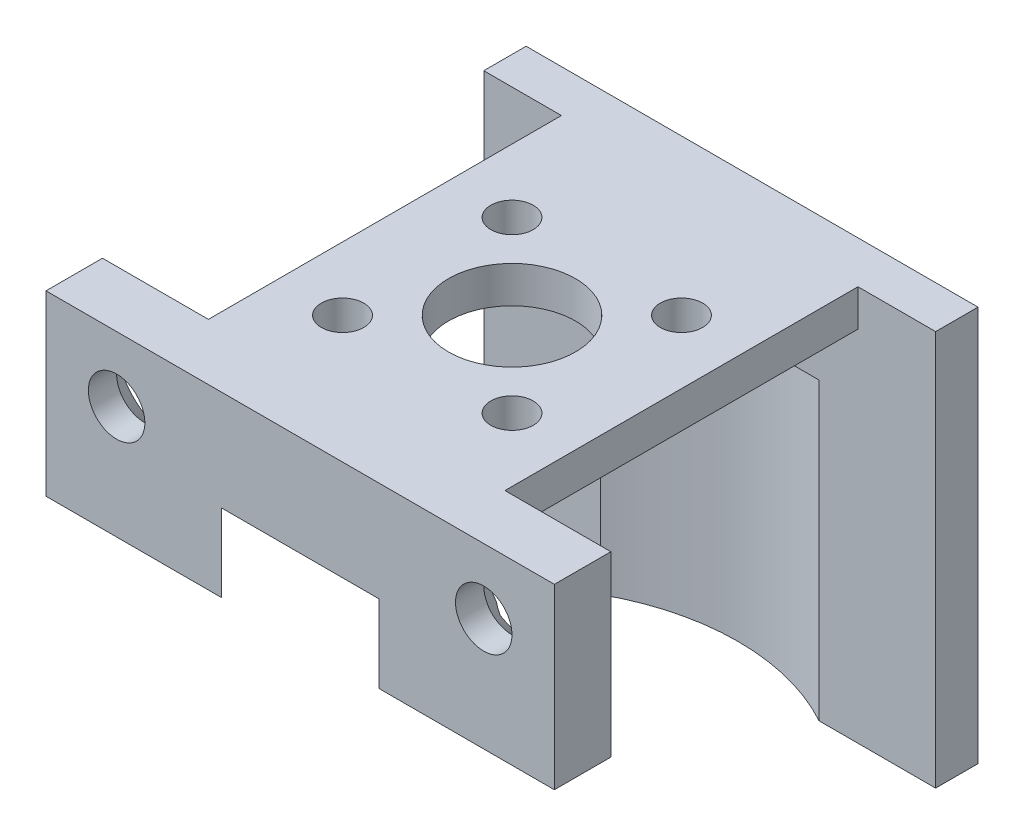
ISO-10303-21;
HEADER;
FILE_DESCRIPTION(('STEP AP214'),'2;1');
FILE_NAME('part.step','',(''),(''),'','','');
FILE_SCHEMA(('AUTOMOTIVE_DESIGN { 1 0 10303 214 1 1 1 1 }'));
ENDSEC;
DATA;
#1=APPLICATION_CONTEXT('core data for automotive mechanical design processes');
#2=APPLICATION_PROTOCOL_DEFINITION('international standard','automotive_design',2000,#1);
#3=PRODUCT_CONTEXT('',#1,'mechanical');
#4=PRODUCT('Part','Part','',(#3));
#5=PRODUCT_RELATED_PRODUCT_CATEGORY('part','',(#4));
#6=PRODUCT_DEFINITION_FORMATION('','',#4);
#7=PRODUCT_DEFINITION_CONTEXT('part definition',#1,'design');
#8=PRODUCT_DEFINITION('design','',#6,#7);
#9=PRODUCT_DEFINITION_SHAPE('','',#8);
#10=(LENGTH_UNIT() NAMED_UNIT(*) SI_UNIT(.MILLI.,.METRE.));
#11=(NAMED_UNIT(*) PLANE_ANGLE_UNIT() SI_UNIT($,.RADIAN.));
#12=(NAMED_UNIT(*) SI_UNIT($,.STERADIAN.) SOLID_ANGLE_UNIT());
#13=UNCERTAINTY_MEASURE_WITH_UNIT(LENGTH_MEASURE(1.E-05),#10,'distance_accuracy_value','');
#14=(GEOMETRIC_REPRESENTATION_CONTEXT(3) GLOBAL_UNCERTAINTY_ASSIGNED_CONTEXT((#13)) GLOBAL_UNIT_ASSIGNED_CONTEXT((#10,
#11,#12)) REPRESENTATION_CONTEXT('',''));
#15=CARTESIAN_POINT('',(0.,0.,0.));
#16=DIRECTION('',(0.,0.,1.));
#17=DIRECTION('',(1.,0.,0.));
#18=AXIS2_PLACEMENT_3D('',#15,#16,#17);
#19=CARTESIAN_POINT('',(-9.,1.3,5.5));
#20=DIRECTION('',(0.,0.,1.));
#21=DIRECTION('',(1.,0.,0.));
#22=AXIS2_PLACEMENT_3D('',#19,#20,#21);
#23=PLANE('',#22);
#24=DIRECTION('',(-1.,0.,0.));
#25=VECTOR('',#24,1.);
#26=CARTESIAN_POINT('',(-9.,0.,5.5));
#27=LINE('',#26,#25);
#28=CARTESIAN_POINT('',(4.76794919243112,0.,5.5));
#29=VERTEX_POINT('',#28);
#30=CARTESIAN_POINT('',(-4.76794919243112,0.,5.5));
#31=VERTEX_POINT('',#30);
#32=EDGE_CURVE('E294',#29,#31,#27,.T.);
#33=ORIENTED_EDGE('',*,*,#32,.F.);
#34=CARTESIAN_POINT('',(6.5,-1.,5.5));
#35=DIRECTION('',(0.,0.,1.));
#36=DIRECTION('',(1.,0.,0.));
#37=AXIS2_PLACEMENT_3D('',#34,#35,#36);
#38=CIRCLE('',#37,2.);
#39=CARTESIAN_POINT('',(4.9387505004004,-2.25,5.5));
#40=VERTEX_POINT('',#39);
#41=EDGE_CURVE('E411',#29,#40,#38,.T.);
#42=ORIENTED_EDGE('',*,*,#41,.T.);
#43=DIRECTION('',(-1.,0.,0.));
#44=VECTOR('',#43,1.);
#45=CARTESIAN_POINT('',(-9.,-2.25,5.5));
#46=LINE('',#45,#44);
#47=CARTESIAN_POINT('',(-4.9387505004004,-2.25,5.5));
#48=VERTEX_POINT('',#47);
#49=EDGE_CURVE('E616',#40,#48,#46,.T.);
#50=ORIENTED_EDGE('',*,*,#49,.T.);
#51=CARTESIAN_POINT('',(-6.5,-1.,5.5));
#52=DIRECTION('',(0.,0.,1.));
#53=DIRECTION('',(1.,0.,0.));
#54=AXIS2_PLACEMENT_3D('',#51,#52,#53);
#55=CIRCLE('',#54,2.);
#56=EDGE_CURVE('E401',#48,#31,#55,.T.);
#57=ORIENTED_EDGE('',*,*,#56,.T.);
#58=EDGE_LOOP('',(#33,#42,#50,#57));
#59=FACE_BOUND('',#58,.T.);
#60=ADVANCED_FACE('F52',(#59),#23,.F.);
#61=DIRECTION('',(0.,-1.,0.));
#62=VECTOR('',#61,1.);
#63=CARTESIAN_POINT('',(-5.25,1.3,5.5));
#64=LINE('',#63,#62);
#65=CARTESIAN_POINT('',(-5.25,1.3,5.5));
#66=VERTEX_POINT('',#65);
#67=CARTESIAN_POINT('',(-5.25,0.561249499599597,5.5));
#68=VERTEX_POINT('',#67);
#69=EDGE_CURVE('E298',#66,#68,#64,.T.);
#70=ORIENTED_EDGE('',*,*,#69,.T.);
#71=CARTESIAN_POINT('',(-6.5,-1.,5.5));
#72=DIRECTION('',(0.,0.,1.));
#73=DIRECTION('',(1.,0.,0.));
#74=AXIS2_PLACEMENT_3D('',#71,#72,#73);
#75=CIRCLE('',#74,2.);
#76=CARTESIAN_POINT('',(-5.80947501931112,-2.87701232042962,5.5));
#77=VERTEX_POINT('',#76);
#78=EDGE_CURVE('E404',#68,#77,#75,.T.);
#79=ORIENTED_EDGE('',*,*,#78,.T.);
#80=DIRECTION('',(0.,-1.,0.));
#81=VECTOR('',#80,1.);
#82=CARTESIAN_POINT('',(-5.80947501931112,22.6274169979695,5.5));
#83=LINE('',#82,#81);
#84=CARTESIAN_POINT('',(-5.80947501931112,-5.,5.5));
#85=VERTEX_POINT('',#84);
#86=EDGE_CURVE('E622',#77,#85,#83,.T.);
#87=ORIENTED_EDGE('',*,*,#86,.T.);
#88=DIRECTION('',(-1.,0.,0.));
#89=VECTOR('',#88,1.);
#90=CARTESIAN_POINT('',(-9.,-5.,5.5));
#91=LINE('',#90,#89);
#92=CARTESIAN_POINT('',(-9.,-5.,5.5));
#93=VERTEX_POINT('',#92);
#94=EDGE_CURVE('E279',#85,#93,#91,.T.);
#95=ORIENTED_EDGE('',*,*,#94,.T.);
#96=DIRECTION('',(0.,-1.,0.));
#97=VECTOR('',#96,1.);
#98=CARTESIAN_POINT('',(-9.,1.3,5.5));
#99=LINE('',#98,#97);
#100=CARTESIAN_POINT('',(-9.,1.3,5.5));
#101=VERTEX_POINT('',#100);
#102=EDGE_CURVE('E319',#101,#93,#99,.T.);
#103=ORIENTED_EDGE('',*,*,#102,.F.);
#104=DIRECTION('',(-1.,0.,0.));
#105=VECTOR('',#104,1.);
#106=CARTESIAN_POINT('',(-9.,1.3,5.5));
#107=LINE('',#106,#105);
#108=EDGE_CURVE('E301',#66,#101,#107,.T.);
#109=ORIENTED_EDGE('',*,*,#108,.F.);
#110=EDGE_LOOP('',(#70,#79,#87,#95,#103,#109));
#111=FACE_BOUND('',#110,.T.);
#112=ADVANCED_FACE('F447',(#111),#23,.F.);
#113=CARTESIAN_POINT('',(0.,0.,-7.));
#114=DIRECTION('',(0.,0.,-1.));
#115=DIRECTION('',(-1.,0.,0.));
#116=AXIS2_PLACEMENT_3D('',#113,#114,#115);
#117=PLANE('',#116);
#118=DIRECTION('',(-1.,0.,0.));
#119=VECTOR('',#118,1.);
#120=CARTESIAN_POINT('',(8.,-12.7,-7.));
#121=LINE('',#120,#119);
#122=CARTESIAN_POINT('',(-3.87298334620742,-12.7,-7.));
#123=VERTEX_POINT('',#122);
#124=CARTESIAN_POINT('',(-8.,-12.7,-7.));
#125=VERTEX_POINT('',#124);
#126=EDGE_CURVE('E237',#123,#125,#121,.T.);
#127=ORIENTED_EDGE('',*,*,#126,.F.);
#128=DIRECTION('',(0.,-1.,0.));
#129=VECTOR('',#128,1.);
#130=CARTESIAN_POINT('',(-3.87298334620742,22.6274169979695,-7.));
#131=LINE('',#130,#129);
#132=CARTESIAN_POINT('',(-3.87298334620742,-2.25,-7.));
#133=VERTEX_POINT('',#132);
#134=EDGE_CURVE('E226',#123,#133,#131,.F.);
#135=ORIENTED_EDGE('',*,*,#134,.T.);
#136=DIRECTION('',(1.,0.,0.));
#137=VECTOR('',#136,1.);
#138=CARTESIAN_POINT('',(0.,-2.25,-7.));
#139=LINE('',#138,#137);
#140=CARTESIAN_POINT('',(3.87298334620742,-2.25,-7.));
#141=VERTEX_POINT('',#140);
#142=EDGE_CURVE('E217',#133,#141,#139,.T.);
#143=ORIENTED_EDGE('',*,*,#142,.T.);
#144=DIRECTION('',(0.,-1.,0.));
#145=VECTOR('',#144,1.);
#146=CARTESIAN_POINT('',(3.87298334620742,22.6274169979695,-7.));
#147=LINE('',#146,#145);
#148=CARTESIAN_POINT('',(3.87298334620742,-12.7,-7.));
#149=VERTEX_POINT('',#148);
#150=EDGE_CURVE('E207',#141,#149,#147,.T.);
#151=ORIENTED_EDGE('',*,*,#150,.T.);
#152=CARTESIAN_POINT('',(8.,-12.7,-7.));
#153=VERTEX_POINT('',#152);
#154=EDGE_CURVE('E213',#153,#149,#121,.T.);
#155=ORIENTED_EDGE('',*,*,#154,.F.);
#156=DIRECTION('',(0.,-1.,0.));
#157=VECTOR('',#156,1.);
#158=CARTESIAN_POINT('',(8.,1.3,-7.));
#159=LINE('',#158,#157);
#160=CARTESIAN_POINT('',(8.,1.3,-7.));
#161=VERTEX_POINT('',#160);
#162=EDGE_CURVE('E243',#161,#153,#159,.T.);
#163=ORIENTED_EDGE('',*,*,#162,.F.);
#164=DIRECTION('',(1.,0.,0.));
#165=VECTOR('',#164,1.);
#166=CARTESIAN_POINT('',(8.,1.3,-7.));
#167=LINE('',#166,#165);
#168=CARTESIAN_POINT('',(5.25,1.3,-7.));
#169=VERTEX_POINT('',#168);
#170=EDGE_CURVE('E241',#169,#161,#167,.T.);
#171=ORIENTED_EDGE('',*,*,#170,.F.);
#172=DIRECTION('',(0.,-1.,0.));
#173=VECTOR('',#172,1.);
#174=CARTESIAN_POINT('',(5.25,1.3,-7.));
#175=LINE('',#174,#173);
#176=CARTESIAN_POINT('',(5.25,0.,-7.));
#177=VERTEX_POINT('',#176);
#178=EDGE_CURVE('E387',#169,#177,#175,.T.);
#179=ORIENTED_EDGE('',*,*,#178,.T.);
#180=DIRECTION('',(-1.,0.,0.));
#181=VECTOR('',#180,1.);
#182=CARTESIAN_POINT('',(-5.25,0.,-7.));
#183=LINE('',#182,#181);
#184=CARTESIAN_POINT('',(-5.25,0.,-7.));
#185=VERTEX_POINT('',#184);
#186=EDGE_CURVE('E379',#177,#185,#183,.T.);
#187=ORIENTED_EDGE('',*,*,#186,.T.);
#188=DIRECTION('',(0.,-1.,0.));
#189=VECTOR('',#188,1.);
#190=CARTESIAN_POINT('',(-5.25,1.3,-7.));
#191=LINE('',#190,#189);
#192=CARTESIAN_POINT('',(-5.25,1.3,-7.));
#193=VERTEX_POINT('',#192);
#194=EDGE_CURVE('E376',#193,#185,#191,.T.);
#195=ORIENTED_EDGE('',*,*,#194,.F.);
#196=CARTESIAN_POINT('',(-8.,1.3,-7.));
#197=VERTEX_POINT('',#196);
#198=EDGE_CURVE('E247',#197,#193,#167,.T.);
#199=ORIENTED_EDGE('',*,*,#198,.F.);
#200=DIRECTION('',(0.,1.,0.));
#201=VECTOR('',#200,1.);
#202=CARTESIAN_POINT('',(-8.,1.3,-7.));
#203=LINE('',#202,#201);
#204=EDGE_CURVE('E236',#125,#197,#203,.T.);
#205=ORIENTED_EDGE('',*,*,#204,.F.);
#206=EDGE_LOOP('',(#127,#135,#143,#151,#155,#163,#171,#179,#187,#195,#199,#205));
#207=FACE_BOUND('',#206,.T.);
#208=ADVANCED_FACE('F210',(#207),#117,.F.);
#209=CARTESIAN_POINT('',(0.,-5.,0.));
#210=DIRECTION('',(0.,-1.,0.));
#211=DIRECTION('',(0.,0.,-1.));
#212=AXIS2_PLACEMENT_3D('',#209,#210,#211);
#213=PLANE('',#212);
#214=CARTESIAN_POINT('',(0.,-5.,0.));
#215=DIRECTION('',(0.,-1.,0.));
#216=DIRECTION('',(0.,0.,-1.));
#217=AXIS2_PLACEMENT_3D('',#214,#215,#216);
#218=CIRCLE('',#217,8.);
#219=CARTESIAN_POINT('',(5.80947501931112,-5.,5.5));
#220=VERTEX_POINT('',#219);
#221=CARTESIAN_POINT('',(2.78388218141501,-5.,7.5));
#222=VERTEX_POINT('',#221);
#223=EDGE_CURVE('E647',#220,#222,#218,.T.);
#224=ORIENTED_EDGE('',*,*,#223,.F.);
#225=CARTESIAN_POINT('',(9.,-5.,5.5));
#226=VERTEX_POINT('',#225);
#227=EDGE_CURVE('E280',#226,#220,#91,.T.);
#228=ORIENTED_EDGE('',*,*,#227,.F.);
#229=DIRECTION('',(0.,0.,-1.));
#230=VECTOR('',#229,1.);
#231=CARTESIAN_POINT('',(9.,-5.,7.5));
#232=LINE('',#231,#230);
#233=CARTESIAN_POINT('',(9.,-5.,7.5));
#234=VERTEX_POINT('',#233);
#235=EDGE_CURVE('E272',#234,#226,#232,.T.);
#236=ORIENTED_EDGE('',*,*,#235,.F.);
#237=DIRECTION('',(1.,0.,0.));
#238=VECTOR('',#237,1.);
#239=CARTESIAN_POINT('',(-9.,-5.,7.5));
#240=LINE('',#239,#238);
#241=EDGE_CURVE('E288',#222,#234,#240,.T.);
#242=ORIENTED_EDGE('',*,*,#241,.F.);
#243=EDGE_LOOP('',(#224,#228,#236,#242));
#244=FACE_BOUND('',#243,.T.);
#245=ADVANCED_FACE('F446',(#244),#213,.T.);
#246=CARTESIAN_POINT('',(5.25,1.3,-7.));
#247=DIRECTION('',(-1.,0.,0.));
#248=DIRECTION('',(0.,0.,1.));
#249=AXIS2_PLACEMENT_3D('',#246,#247,#248);
#250=PLANE('',#249);
#251=DIRECTION('',(0.,1.,0.));
#252=VECTOR('',#251,1.);
#253=CARTESIAN_POINT('',(5.25,1.3,5.5));
#254=LINE('',#253,#252);
#255=CARTESIAN_POINT('',(5.25,0.561249499599603,5.5));
#256=VERTEX_POINT('',#255);
#257=CARTESIAN_POINT('',(5.25,1.3,5.5));
#258=VERTEX_POINT('',#257);
#259=EDGE_CURVE('E326',#256,#258,#254,.T.);
#260=ORIENTED_EDGE('',*,*,#259,.F.);
#261=CARTESIAN_POINT('',(5.25,0.561249499599603,5.5));
#262=CARTESIAN_POINT('',(5.25,0.515972839032118,5.53533152972727));
#263=CARTESIAN_POINT('',(5.25,0.470413490644683,5.57030814783722));
#264=CARTESIAN_POINT('',(5.25,0.378625271602395,5.63930639900533));
#265=CARTESIAN_POINT('',(5.25,0.332396860986103,5.67332864501015));
#266=CARTESIAN_POINT('',(5.25,0.239096993291989,5.740227344441));
#267=CARTESIAN_POINT('',(5.25,0.19202535450844,5.77310354630016));
#268=CARTESIAN_POINT('',(5.25,0.0968359041664896,5.83737054452449));
#269=CARTESIAN_POINT('',(5.25,0.0487174212633597,5.86876034406461));
#270=CARTESIAN_POINT('',(5.25,0.,5.89921894064179));
#271=B_SPLINE_CURVE_WITH_KNOTS('',3,(#261,#262,#263,#264,#265,#266,#267,#268,#269,#270),
.UNSPECIFIED.,.F.,.F.,(4,2,2,2,4),(0.,0.17229682931652,0.344480342270378,0.516701416037533,
0.689036396392575),.UNSPECIFIED.);
#272=CARTESIAN_POINT('',(5.25,0.,5.89921894064179));
#273=VERTEX_POINT('',#272);
#274=EDGE_CURVE('E531',#256,#273,#271,.T.);
#275=ORIENTED_EDGE('',*,*,#274,.T.);
#276=DIRECTION('',(0.,0.,-1.));
#277=VECTOR('',#276,1.);
#278=CARTESIAN_POINT('',(5.25,0.,-7.));
#279=LINE('',#278,#277);
#280=EDGE_CURVE('E82',#273,#177,#279,.T.);
#281=ORIENTED_EDGE('',*,*,#280,.T.);
#282=ORIENTED_EDGE('',*,*,#178,.F.);
#283=DIRECTION('',(0.,0.,-1.));
#284=VECTOR('',#283,1.);
#285=CARTESIAN_POINT('',(5.25,1.3,-7.));
#286=LINE('',#285,#284);
#287=EDGE_CURVE('E369',#258,#169,#286,.T.);
#288=ORIENTED_EDGE('',*,*,#287,.F.);
#289=EDGE_LOOP('',(#260,#275,#281,#282,#288));
#290=FACE_BOUND('',#289,.T.);
#291=ADVANCED_FACE('F551',(#290),#250,.F.);
#292=CARTESIAN_POINT('',(-5.25,1.3,-7.));
#293=DIRECTION('',(1.,0.,0.));
#294=DIRECTION('',(0.,0.,-1.));
#295=AXIS2_PLACEMENT_3D('',#292,#293,#294);
#296=PLANE('',#295);
#297=ORIENTED_EDGE('',*,*,#69,.F.);
#298=DIRECTION('',(0.,0.,1.));
#299=VECTOR('',#298,1.);
#300=CARTESIAN_POINT('',(-5.25,1.3,-7.));
#301=LINE('',#300,#299);
#302=EDGE_CURVE('E372',#193,#66,#301,.T.);
#303=ORIENTED_EDGE('',*,*,#302,.F.);
#304=ORIENTED_EDGE('',*,*,#194,.T.);
#305=DIRECTION('',(0.,0.,1.));
#306=VECTOR('',#305,1.);
#307=CARTESIAN_POINT('',(-5.25,0.,-7.));
#308=LINE('',#307,#306);
#309=CARTESIAN_POINT('',(-5.25,0.,5.89921894064178));
#310=VERTEX_POINT('',#309);
#311=EDGE_CURVE('E74',#185,#310,#308,.T.);
#312=ORIENTED_EDGE('',*,*,#311,.T.);
#313=CARTESIAN_POINT('',(-5.25,0.,5.89921894064178));
#314=CARTESIAN_POINT('',(-5.25,0.0487174212633596,5.8687603440646));
#315=CARTESIAN_POINT('',(-5.25,0.096835904166489,5.83737054452449));
#316=CARTESIAN_POINT('',(-5.25,0.192025354508438,5.77310354630015));
#317=CARTESIAN_POINT('',(-5.25,0.239096993291986,5.740227344441));
#318=CARTESIAN_POINT('',(-5.25,0.332396860986099,5.67332864501015));
#319=CARTESIAN_POINT('',(-5.25,0.378625271602391,5.63930639900533));
#320=CARTESIAN_POINT('',(-5.25,0.470413490644677,5.57030814783722));
#321=CARTESIAN_POINT('',(-5.25,0.515972839032112,5.53533152972727));
#322=CARTESIAN_POINT('',(-5.25,0.561249499599596,5.5));
#323=B_SPLINE_CURVE_WITH_KNOTS('',3,(#313,#314,#315,#316,#317,#318,#319,#320,#321,#322),
.UNSPECIFIED.,.F.,.F.,(4,2,2,2,4),(0.,0.17233498035504,0.344556054122192,0.516739567076047,
0.689036396392564),.UNSPECIFIED.);
#324=EDGE_CURVE('E13',#310,#68,#323,.T.);
#325=ORIENTED_EDGE('',*,*,#324,.T.);
#326=EDGE_LOOP('',(#297,#303,#304,#312,#325));
#327=FACE_BOUND('',#326,.T.);
#328=ADVANCED_FACE('F509',(#327),#296,.F.);
#329=CARTESIAN_POINT('',(0.,1.3,0.));
#330=DIRECTION('',(0.,1.,0.));
#331=DIRECTION('',(0.,0.,1.));
#332=AXIS2_PLACEMENT_3D('',#329,#330,#331);
#333=PLANE('',#332);
#334=CARTESIAN_POINT('',(9.,1.3,5.5));
#335=VERTEX_POINT('',#334);
#336=EDGE_CURVE('E302',#335,#258,#107,.T.);
#337=ORIENTED_EDGE('',*,*,#336,.T.);
#338=ORIENTED_EDGE('',*,*,#287,.T.);
#339=ORIENTED_EDGE('',*,*,#170,.T.);
#340=DIRECTION('',(0.,0.,1.));
#341=VECTOR('',#340,1.);
#342=CARTESIAN_POINT('',(8.,1.3,-8.5));
#343=LINE('',#342,#341);
#344=CARTESIAN_POINT('',(8.,1.3,-8.5));
#345=VERTEX_POINT('',#344);
#346=EDGE_CURVE('E252',#345,#161,#343,.T.);
#347=ORIENTED_EDGE('',*,*,#346,.F.);
#348=DIRECTION('',(1.,0.,0.));
#349=VECTOR('',#348,1.);
#350=CARTESIAN_POINT('',(8.,1.3,-8.5));
#351=LINE('',#350,#349);
#352=CARTESIAN_POINT('',(-8.,1.3,-8.5));
#353=VERTEX_POINT('',#352);
#354=EDGE_CURVE('E257',#353,#345,#351,.T.);
#355=ORIENTED_EDGE('',*,*,#354,.F.);
#356=DIRECTION('',(0.,0.,1.));
#357=VECTOR('',#356,1.);
#358=CARTESIAN_POINT('',(-8.,1.3,-8.5));
#359=LINE('',#358,#357);
#360=EDGE_CURVE('E256',#353,#197,#359,.T.);
#361=ORIENTED_EDGE('',*,*,#360,.T.);
#362=ORIENTED_EDGE('',*,*,#198,.T.);
#363=ORIENTED_EDGE('',*,*,#302,.T.);
#364=ORIENTED_EDGE('',*,*,#108,.T.);
#365=DIRECTION('',(0.,0.,1.));
#366=VECTOR('',#365,1.);
#367=CARTESIAN_POINT('',(-9.,1.3,7.));
#368=LINE('',#367,#366);
#369=CARTESIAN_POINT('',(-9.,1.3,7.5));
#370=VERTEX_POINT('',#369);
#371=EDGE_CURVE('E306',#101,#370,#368,.T.);
#372=ORIENTED_EDGE('',*,*,#371,.T.);
#373=DIRECTION('',(1.,0.,0.));
#374=VECTOR('',#373,1.);
#375=CARTESIAN_POINT('',(-9.,1.3,7.5));
#376=LINE('',#375,#374);
#377=CARTESIAN_POINT('',(9.,1.3,7.5));
#378=VERTEX_POINT('',#377);
#379=EDGE_CURVE('E309',#370,#378,#376,.T.);
#380=ORIENTED_EDGE('',*,*,#379,.T.);
#381=DIRECTION('',(0.,0.,-1.));
#382=VECTOR('',#381,1.);
#383=CARTESIAN_POINT('',(9.,1.3,7.5));
#384=LINE('',#383,#382);
#385=EDGE_CURVE('E293',#378,#335,#384,.T.);
#386=ORIENTED_EDGE('',*,*,#385,.T.);
#387=EDGE_LOOP('',(#337,#338,#339,#347,#355,#361,#362,#363,#364,#372,#380,#386));
#388=FACE_BOUND('',#387,.T.);
#389=CARTESIAN_POINT('',(3.,1.3,3.));
#390=DIRECTION('',(0.,1.,0.));
#391=DIRECTION('',(0.,0.,1.));
#392=AXIS2_PLACEMENT_3D('',#389,#390,#391);
#393=CIRCLE('',#392,0.75);
#394=CARTESIAN_POINT('',(3.,1.3,3.75));
#395=VERTEX_POINT('',#394);
#396=EDGE_CURVE('E338',#395,#395,#393,.T.);
#397=ORIENTED_EDGE('',*,*,#396,.F.);
#398=EDGE_LOOP('',(#397));
#399=FACE_BOUND('',#398,.T.);
#400=CARTESIAN_POINT('',(3.,1.3,-3.));
#401=DIRECTION('',(0.,1.,0.));
#402=DIRECTION('',(0.,0.,1.));
#403=AXIS2_PLACEMENT_3D('',#400,#401,#402);
#404=CIRCLE('',#403,0.75);
#405=CARTESIAN_POINT('',(3.,1.3,-2.25));
#406=VERTEX_POINT('',#405);
#407=EDGE_CURVE('E354',#406,#406,#404,.T.);
#408=ORIENTED_EDGE('',*,*,#407,.F.);
#409=EDGE_LOOP('',(#408));
#410=FACE_BOUND('',#409,.T.);
#411=CARTESIAN_POINT('',(-3.,1.3,-3.));
#412=DIRECTION('',(0.,1.,0.));
#413=DIRECTION('',(0.,0.,1.));
#414=AXIS2_PLACEMENT_3D('',#411,#412,#413);
#415=CIRCLE('',#414,0.75);
#416=CARTESIAN_POINT('',(-3.,1.3,-2.25));
#417=VERTEX_POINT('',#416);
#418=EDGE_CURVE('E362',#417,#417,#415,.T.);
#419=ORIENTED_EDGE('',*,*,#418,.F.);
#420=EDGE_LOOP('',(#419));
#421=FACE_BOUND('',#420,.T.);
#422=CARTESIAN_POINT('',(-3.,1.3,3.));
#423=DIRECTION('',(0.,1.,0.));
#424=DIRECTION('',(0.,0.,1.));
#425=AXIS2_PLACEMENT_3D('',#422,#423,#424);
#426=CIRCLE('',#425,0.75);
#427=CARTESIAN_POINT('',(-3.,1.3,3.75));
#428=VERTEX_POINT('',#427);
#429=EDGE_CURVE('E346',#428,#428,#426,.T.);
#430=ORIENTED_EDGE('',*,*,#429,.F.);
#431=EDGE_LOOP('',(#430));
#432=FACE_BOUND('',#431,.T.);
#433=CARTESIAN_POINT('',(0.,1.3,0.));
#434=DIRECTION('',(0.,1.,0.));
#435=DIRECTION('',(0.,0.,1.));
#436=AXIS2_PLACEMENT_3D('',#433,#434,#435);
#437=CIRCLE('',#436,2.25);
#438=CARTESIAN_POINT('',(0.,1.3,2.25));
#439=VERTEX_POINT('',#438);
#440=EDGE_CURVE('E330',#439,#439,#437,.T.);
#441=ORIENTED_EDGE('',*,*,#440,.F.);
#442=EDGE_LOOP('',(#441));
#443=FACE_BOUND('',#442,.T.);
#444=ADVANCED_FACE('F506',(#388,#399,#410,#421,#432,#443),#333,.T.);
#445=CARTESIAN_POINT('',(0.,0.,0.));
#446=DIRECTION('',(0.,1.,0.));
#447=DIRECTION('',(0.,0.,1.));
#448=AXIS2_PLACEMENT_3D('',#445,#446,#447);
#449=PLANE('',#448);
#450=ORIENTED_EDGE('',*,*,#280,.F.);
#451=CARTESIAN_POINT('',(5.25,0.,5.89921894064179));
#452=CARTESIAN_POINT('',(5.20888549176698,0.,5.86710384620214));
#453=CARTESIAN_POINT('',(5.16806304160631,0.,5.83461911948212));
#454=CARTESIAN_POINT('',(5.0869195779337,0.,5.76904161276629));
#455=CARTESIAN_POINT('',(5.04659848673631,0.,5.7359489289927));
#456=CARTESIAN_POINT('',(4.9663642156088,0.,5.6692782245789));
#457=CARTESIAN_POINT('',(4.92645101541853,0.,5.63570022824636));
#458=CARTESIAN_POINT('',(4.84696150306648,0.,5.56813502795902));
#459=CARTESIAN_POINT('',(4.80738524455259,0.,5.53414776084571));
#460=CARTESIAN_POINT('',(4.76794919243112,0.,5.5));
#461=B_SPLINE_CURVE_WITH_KNOTS('',3,(#451,#452,#453,#454,#455,#456,#457,#458,#459,#460),
.UNSPECIFIED.,.F.,.F.,(4,2,2,2,4),(0.,0.156506213522541,0.31298786642027,0.469461708654002,
0.625960015462488),.UNSPECIFIED.);
#462=EDGE_CURVE('E517',#273,#29,#461,.T.);
#463=ORIENTED_EDGE('',*,*,#462,.T.);
#464=ORIENTED_EDGE('',*,*,#32,.T.);
#465=CARTESIAN_POINT('',(-4.76794919243112,0.,5.5));
#466=CARTESIAN_POINT('',(-4.80738524455259,0.,5.53414776084571));
#467=CARTESIAN_POINT('',(-4.84696150306648,0.,5.56813502795901));
#468=CARTESIAN_POINT('',(-4.92645101541853,0.,5.63570022824635));
#469=CARTESIAN_POINT('',(-4.96636421560879,0.,5.66927822457889));
#470=CARTESIAN_POINT('',(-5.04659848673631,0.,5.7359489289927));
#471=CARTESIAN_POINT('',(-5.08691957793369,0.,5.76904161276629));
#472=CARTESIAN_POINT('',(-5.1680630416063,0.,5.83461911948211));
#473=CARTESIAN_POINT('',(-5.20888549176698,0.,5.86710384620214));
#474=CARTESIAN_POINT('',(-5.25,0.,5.89921894064178));
#475=B_SPLINE_CURVE_WITH_KNOTS('',3,(#465,#466,#467,#468,#469,#470,#471,#472,#473,#474),
.UNSPECIFIED.,.F.,.F.,(4,2,2,2,4),(0.,0.156498306808483,0.312972149042212,0.469453801939939,
0.625960015462476),.UNSPECIFIED.);
#476=EDGE_CURVE('E68',#31,#310,#475,.T.);
#477=ORIENTED_EDGE('',*,*,#476,.T.);
#478=ORIENTED_EDGE('',*,*,#311,.F.);
#479=ORIENTED_EDGE('',*,*,#186,.F.);
#480=EDGE_LOOP('',(#450,#463,#464,#477,#478,#479));
#481=FACE_BOUND('',#480,.T.);
#482=CARTESIAN_POINT('',(0.,0.,0.));
#483=DIRECTION('',(0.,1.,0.));
#484=DIRECTION('',(0.,0.,1.));
#485=AXIS2_PLACEMENT_3D('',#482,#483,#484);
#486=CIRCLE('',#485,2.25);
#487=CARTESIAN_POINT('',(0.,0.,2.25));
#488=VERTEX_POINT('',#487);
#489=EDGE_CURVE('E329',#488,#488,#486,.T.);
#490=ORIENTED_EDGE('',*,*,#489,.T.);
#491=EDGE_LOOP('',(#490));
#492=FACE_BOUND('',#491,.T.);
#493=CARTESIAN_POINT('',(3.,0.,3.));
#494=DIRECTION('',(0.,1.,0.));
#495=DIRECTION('',(0.,0.,1.));
#496=AXIS2_PLACEMENT_3D('',#493,#494,#495);
#497=CIRCLE('',#496,0.75);
#498=CARTESIAN_POINT('',(3.,0.,3.75));
#499=VERTEX_POINT('',#498);
#500=EDGE_CURVE('E334',#499,#499,#497,.T.);
#501=ORIENTED_EDGE('',*,*,#500,.T.);
#502=EDGE_LOOP('',(#501));
#503=FACE_BOUND('',#502,.T.);
#504=CARTESIAN_POINT('',(-3.,0.,3.));
#505=DIRECTION('',(0.,1.,0.));
#506=DIRECTION('',(0.,0.,1.));
#507=AXIS2_PLACEMENT_3D('',#504,#505,#506);
#508=CIRCLE('',#507,0.75);
#509=CARTESIAN_POINT('',(-3.,0.,3.75));
#510=VERTEX_POINT('',#509);
#511=EDGE_CURVE('E342',#510,#510,#508,.T.);
#512=ORIENTED_EDGE('',*,*,#511,.T.);
#513=EDGE_LOOP('',(#512));
#514=FACE_BOUND('',#513,.T.);
#515=CARTESIAN_POINT('',(3.,0.,-3.));
#516=DIRECTION('',(0.,1.,0.));
#517=DIRECTION('',(0.,0.,1.));
#518=AXIS2_PLACEMENT_3D('',#515,#516,#517);
#519=CIRCLE('',#518,0.75);
#520=CARTESIAN_POINT('',(3.,0.,-2.25));
#521=VERTEX_POINT('',#520);
#522=EDGE_CURVE('E350',#521,#521,#519,.T.);
#523=ORIENTED_EDGE('',*,*,#522,.T.);
#524=EDGE_LOOP('',(#523));
#525=FACE_BOUND('',#524,.T.);
#526=CARTESIAN_POINT('',(-3.,0.,-3.));
#527=DIRECTION('',(0.,1.,0.));
#528=DIRECTION('',(0.,0.,1.));
#529=AXIS2_PLACEMENT_3D('',#526,#527,#528);
#530=CIRCLE('',#529,0.75);
#531=CARTESIAN_POINT('',(-3.,0.,-2.25));
#532=VERTEX_POINT('',#531);
#533=EDGE_CURVE('E358',#532,#532,#530,.T.);
#534=ORIENTED_EDGE('',*,*,#533,.T.);
#535=EDGE_LOOP('',(#534));
#536=FACE_BOUND('',#535,.T.);
#537=ADVANCED_FACE('F504',(#481,#492,#503,#514,#525,#536),#449,.F.);
#538=CARTESIAN_POINT('',(-3.,1.3,-3.));
#539=DIRECTION('',(0.,-1.,0.));
#540=DIRECTION('',(0.,0.,-1.));
#541=AXIS2_PLACEMENT_3D('',#538,#539,#540);
#542=CYLINDRICAL_SURFACE('',#541,0.75);
#543=ORIENTED_EDGE('',*,*,#418,.T.);
#544=EDGE_LOOP('',(#543));
#545=FACE_BOUND('',#544,.T.);
#546=ORIENTED_EDGE('',*,*,#533,.F.);
#547=EDGE_LOOP('',(#546));
#548=FACE_BOUND('',#547,.T.);
#549=ADVANCED_FACE('F500',(#545,#548),#542,.F.);
#550=CARTESIAN_POINT('',(3.,1.3,-3.));
#551=DIRECTION('',(0.,-1.,0.));
#552=DIRECTION('',(0.,0.,-1.));
#553=AXIS2_PLACEMENT_3D('',#550,#551,#552);
#554=CYLINDRICAL_SURFACE('',#553,0.75);
#555=ORIENTED_EDGE('',*,*,#407,.T.);
#556=EDGE_LOOP('',(#555));
#557=FACE_BOUND('',#556,.T.);
#558=ORIENTED_EDGE('',*,*,#522,.F.);
#559=EDGE_LOOP('',(#558));
#560=FACE_BOUND('',#559,.T.);
#561=ADVANCED_FACE('F496',(#557,#560),#554,.F.);
#562=CARTESIAN_POINT('',(-3.,1.3,3.));
#563=DIRECTION('',(0.,-1.,0.));
#564=DIRECTION('',(0.,0.,-1.));
#565=AXIS2_PLACEMENT_3D('',#562,#563,#564);
#566=CYLINDRICAL_SURFACE('',#565,0.75);
#567=ORIENTED_EDGE('',*,*,#429,.T.);
#568=EDGE_LOOP('',(#567));
#569=FACE_BOUND('',#568,.T.);
#570=ORIENTED_EDGE('',*,*,#511,.F.);
#571=EDGE_LOOP('',(#570));
#572=FACE_BOUND('',#571,.T.);
#573=ADVANCED_FACE('F492',(#569,#572),#566,.F.);
#574=CARTESIAN_POINT('',(3.,1.3,3.));
#575=DIRECTION('',(0.,-1.,0.));
#576=DIRECTION('',(0.,0.,-1.));
#577=AXIS2_PLACEMENT_3D('',#574,#575,#576);
#578=CYLINDRICAL_SURFACE('',#577,0.75);
#579=ORIENTED_EDGE('',*,*,#396,.T.);
#580=EDGE_LOOP('',(#579));
#581=FACE_BOUND('',#580,.T.);
#582=ORIENTED_EDGE('',*,*,#500,.F.);
#583=EDGE_LOOP('',(#582));
#584=FACE_BOUND('',#583,.T.);
#585=ADVANCED_FACE('F488',(#581,#584),#578,.F.);
#586=CARTESIAN_POINT('',(0.,1.3,0.));
#587=DIRECTION('',(0.,-1.,0.));
#588=DIRECTION('',(0.,0.,-1.));
#589=AXIS2_PLACEMENT_3D('',#586,#587,#588);
#590=CYLINDRICAL_SURFACE('',#589,2.25);
#591=ORIENTED_EDGE('',*,*,#440,.T.);
#592=EDGE_LOOP('',(#591));
#593=FACE_BOUND('',#592,.T.);
#594=ORIENTED_EDGE('',*,*,#489,.F.);
#595=EDGE_LOOP('',(#594));
#596=FACE_BOUND('',#595,.T.);
#597=ADVANCED_FACE('F481',(#593,#596),#590,.F.);
#598=DIRECTION('',(0.,-1.,0.));
#599=VECTOR('',#598,1.);
#600=CARTESIAN_POINT('',(5.80947501931112,22.6274169979695,5.5));
#601=LINE('',#600,#599);
#602=CARTESIAN_POINT('',(5.80947501931112,-2.87701232042963,5.5));
#603=VERTEX_POINT('',#602);
#604=EDGE_CURVE('E627',#220,#603,#601,.F.);
#605=ORIENTED_EDGE('',*,*,#604,.T.);
#606=CARTESIAN_POINT('',(6.5,-1.,5.5));
#607=DIRECTION('',(0.,0.,1.));
#608=DIRECTION('',(1.,0.,0.));
#609=AXIS2_PLACEMENT_3D('',#606,#607,#608);
#610=CIRCLE('',#609,2.);
#611=EDGE_CURVE('E408',#603,#256,#610,.T.);
#612=ORIENTED_EDGE('',*,*,#611,.T.);
#613=ORIENTED_EDGE('',*,*,#259,.T.);
#614=ORIENTED_EDGE('',*,*,#336,.F.);
#615=DIRECTION('',(0.,-1.,0.));
#616=VECTOR('',#615,1.);
#617=CARTESIAN_POINT('',(9.,1.3,5.5));
#618=LINE('',#617,#616);
#619=EDGE_CURVE('E323',#335,#226,#618,.T.);
#620=ORIENTED_EDGE('',*,*,#619,.T.);
#621=ORIENTED_EDGE('',*,*,#227,.T.);
#622=EDGE_LOOP('',(#605,#612,#613,#614,#620,#621));
#623=FACE_BOUND('',#622,.T.);
#624=ADVANCED_FACE('F478',(#623),#23,.F.);
#625=CARTESIAN_POINT('',(9.,1.3,5.5));
#626=DIRECTION('',(-1.,0.,0.));
#627=DIRECTION('',(0.,0.,1.));
#628=AXIS2_PLACEMENT_3D('',#625,#626,#627);
#629=PLANE('',#628);
#630=DIRECTION('',(0.,-1.,0.));
#631=VECTOR('',#630,1.);
#632=CARTESIAN_POINT('',(9.,1.3,7.5));
#633=LINE('',#632,#631);
#634=EDGE_CURVE('E312',#378,#234,#633,.T.);
#635=ORIENTED_EDGE('',*,*,#634,.T.);
#636=ORIENTED_EDGE('',*,*,#235,.T.);
#637=ORIENTED_EDGE('',*,*,#619,.F.);
#638=ORIENTED_EDGE('',*,*,#385,.F.);
#639=EDGE_LOOP('',(#635,#636,#637,#638));
#640=FACE_BOUND('',#639,.T.);
#641=ADVANCED_FACE('F476',(#640),#629,.F.);
#642=CARTESIAN_POINT('',(-9.,1.3,7.));
#643=DIRECTION('',(1.,0.,0.));
#644=DIRECTION('',(0.,0.,-1.));
#645=AXIS2_PLACEMENT_3D('',#642,#643,#644);
#646=PLANE('',#645);
#647=ORIENTED_EDGE('',*,*,#102,.T.);
#648=DIRECTION('',(0.,0.,1.));
#649=VECTOR('',#648,1.);
#650=CARTESIAN_POINT('',(-9.,-5.,7.));
#651=LINE('',#650,#649);
#652=CARTESIAN_POINT('',(-9.,-5.,7.5));
#653=VERTEX_POINT('',#652);
#654=EDGE_CURVE('E284',#93,#653,#651,.T.);
#655=ORIENTED_EDGE('',*,*,#654,.T.);
#656=DIRECTION('',(0.,-1.,0.));
#657=VECTOR('',#656,1.);
#658=CARTESIAN_POINT('',(-9.,1.3,7.5));
#659=LINE('',#658,#657);
#660=EDGE_CURVE('E316',#370,#653,#659,.T.);
#661=ORIENTED_EDGE('',*,*,#660,.F.);
#662=ORIENTED_EDGE('',*,*,#371,.F.);
#663=EDGE_LOOP('',(#647,#655,#661,#662));
#664=FACE_BOUND('',#663,.T.);
#665=ADVANCED_FACE('F472',(#664),#646,.F.);
#666=CARTESIAN_POINT('',(-9.,1.3,7.5));
#667=DIRECTION('',(0.,0.,-1.));
#668=DIRECTION('',(-1.,0.,0.));
#669=AXIS2_PLACEMENT_3D('',#666,#667,#668);
#670=PLANE('',#669);
#671=CARTESIAN_POINT('',(6.5,-1.,7.5));
#672=DIRECTION('',(0.,0.,-1.));
#673=DIRECTION('',(-1.,0.,0.));
#674=AXIS2_PLACEMENT_3D('',#671,#672,#673);
#675=CIRCLE('',#674,1.);
#676=CARTESIAN_POINT('',(5.5,-1.,7.5));
#677=VERTEX_POINT('',#676);
#678=EDGE_CURVE('E268',#677,#677,#675,.T.);
#679=ORIENTED_EDGE('',*,*,#678,.T.);
#680=EDGE_LOOP('',(#679));
#681=FACE_BOUND('',#680,.T.);
#682=CARTESIAN_POINT('',(-6.5,-1.,7.5));
#683=DIRECTION('',(0.,0.,-1.));
#684=DIRECTION('',(-1.,0.,0.));
#685=AXIS2_PLACEMENT_3D('',#682,#683,#684);
#686=CIRCLE('',#685,1.);
#687=CARTESIAN_POINT('',(-7.5,-1.,7.5));
#688=VERTEX_POINT('',#687);
#689=EDGE_CURVE('E267',#688,#688,#686,.T.);
#690=ORIENTED_EDGE('',*,*,#689,.T.);
#691=EDGE_LOOP('',(#690));
#692=FACE_BOUND('',#691,.T.);
#693=DIRECTION('',(1.,0.,0.));
#694=VECTOR('',#693,1.);
#695=CARTESIAN_POINT('',(-9.,-2.25,7.5));
#696=LINE('',#695,#694);
#697=CARTESIAN_POINT('',(-2.78388218141501,-2.25,7.5));
#698=VERTEX_POINT('',#697);
#699=CARTESIAN_POINT('',(2.78388218141501,-2.25,7.5));
#700=VERTEX_POINT('',#699);
#701=EDGE_CURVE('E618',#698,#700,#696,.T.);
#702=ORIENTED_EDGE('',*,*,#701,.T.);
#703=DIRECTION('',(0.,-1.,0.));
#704=VECTOR('',#703,1.);
#705=CARTESIAN_POINT('',(2.78388218141501,22.6274169979695,7.5));
#706=LINE('',#705,#704);
#707=EDGE_CURVE('E631',#700,#222,#706,.T.);
#708=ORIENTED_EDGE('',*,*,#707,.T.);
#709=ORIENTED_EDGE('',*,*,#241,.T.);
#710=ORIENTED_EDGE('',*,*,#634,.F.);
#711=ORIENTED_EDGE('',*,*,#379,.F.);
#712=ORIENTED_EDGE('',*,*,#660,.T.);
#713=CARTESIAN_POINT('',(-2.78388218141501,-5.,7.5));
#714=VERTEX_POINT('',#713);
#715=EDGE_CURVE('E289',#653,#714,#240,.T.);
#716=ORIENTED_EDGE('',*,*,#715,.T.);
#717=DIRECTION('',(0.,-1.,0.));
#718=VECTOR('',#717,1.);
#719=CARTESIAN_POINT('',(-2.78388218141501,22.6274169979695,7.5));
#720=LINE('',#719,#718);
#721=EDGE_CURVE('E635',#714,#698,#720,.F.);
#722=ORIENTED_EDGE('',*,*,#721,.T.);
#723=EDGE_LOOP('',(#702,#708,#709,#710,#711,#712,#716,#722));
#724=FACE_BOUND('',#723,.T.);
#725=ADVANCED_FACE('F468',(#681,#692,#724),#670,.F.);
#726=EDGE_CURVE('E229',#714,#85,#218,.T.);
#727=ORIENTED_EDGE('',*,*,#726,.F.);
#728=ORIENTED_EDGE('',*,*,#715,.F.);
#729=ORIENTED_EDGE('',*,*,#654,.F.);
#730=ORIENTED_EDGE('',*,*,#94,.F.);
#731=EDGE_LOOP('',(#727,#728,#729,#730));
#732=FACE_BOUND('',#731,.T.);
#733=ADVANCED_FACE('F464',(#732),#213,.T.);
#734=CARTESIAN_POINT('',(-6.5,-1.,7.5));
#735=DIRECTION('',(0.,0.,-1.));
#736=DIRECTION('',(-1.,0.,0.));
#737=AXIS2_PLACEMENT_3D('',#734,#735,#736);
#738=CYLINDRICAL_SURFACE('',#737,1.);
#739=CARTESIAN_POINT('',(-6.5,-1.,6.5));
#740=DIRECTION('',(0.,0.,1.));
#741=DIRECTION('',(1.,0.,0.));
#742=AXIS2_PLACEMENT_3D('',#739,#740,#741);
#743=CIRCLE('',#742,1.);
#744=CARTESIAN_POINT('',(-5.5,-1.,6.5));
#745=VERTEX_POINT('',#744);
#746=EDGE_CURVE('E540',#745,#745,#743,.F.);
#747=ORIENTED_EDGE('',*,*,#746,.T.);
#748=EDGE_LOOP('',(#747));
#749=FACE_BOUND('',#748,.T.);
#750=ORIENTED_EDGE('',*,*,#689,.F.);
#751=EDGE_LOOP('',(#750));
#752=FACE_BOUND('',#751,.T.);
#753=ADVANCED_FACE('F460',(#749,#752),#738,.F.);
#754=CARTESIAN_POINT('',(6.5,-1.,7.5));
#755=DIRECTION('',(0.,0.,-1.));
#756=DIRECTION('',(-1.,0.,0.));
#757=AXIS2_PLACEMENT_3D('',#754,#755,#756);
#758=CYLINDRICAL_SURFACE('',#757,1.);
#759=CARTESIAN_POINT('',(6.5,-1.,6.5));
#760=DIRECTION('',(0.,0.,1.));
#761=DIRECTION('',(1.,0.,0.));
#762=AXIS2_PLACEMENT_3D('',#759,#760,#761);
#763=CIRCLE('',#762,1.);
#764=CARTESIAN_POINT('',(7.5,-1.,6.5));
#765=VERTEX_POINT('',#764);
#766=EDGE_CURVE('E221',#765,#765,#763,.F.);
#767=ORIENTED_EDGE('',*,*,#766,.T.);
#768=EDGE_LOOP('',(#767));
#769=FACE_BOUND('',#768,.T.);
#770=ORIENTED_EDGE('',*,*,#678,.F.);
#771=EDGE_LOOP('',(#770));
#772=FACE_BOUND('',#771,.T.);
#773=ADVANCED_FACE('F456',(#769,#772),#758,.F.);
#774=CARTESIAN_POINT('',(8.,1.3,-8.5));
#775=DIRECTION('',(-1.,0.,0.));
#776=DIRECTION('',(0.,-1.,0.));
#777=AXIS2_PLACEMENT_3D('',#774,#775,#776);
#778=PLANE('',#777);
#779=ORIENTED_EDGE('',*,*,#162,.T.);
#780=DIRECTION('',(0.,0.,1.));
#781=VECTOR('',#780,1.);
#782=CARTESIAN_POINT('',(8.,-12.7,-8.5));
#783=LINE('',#782,#781);
#784=CARTESIAN_POINT('',(8.,-12.7,-8.5));
#785=VERTEX_POINT('',#784);
#786=EDGE_CURVE('E233',#785,#153,#783,.T.);
#787=ORIENTED_EDGE('',*,*,#786,.F.);
#788=DIRECTION('',(0.,-1.,0.));
#789=VECTOR('',#788,1.);
#790=CARTESIAN_POINT('',(8.,1.3,-8.5));
#791=LINE('',#790,#789);
#792=EDGE_CURVE('E251',#345,#785,#791,.T.);
#793=ORIENTED_EDGE('',*,*,#792,.F.);
#794=ORIENTED_EDGE('',*,*,#346,.T.);
#795=EDGE_LOOP('',(#779,#787,#793,#794));
#796=FACE_BOUND('',#795,.T.);
#797=ADVANCED_FACE('F453',(#796),#778,.F.);
#798=CARTESIAN_POINT('',(8.,-12.7,-8.5));
#799=DIRECTION('',(0.,1.,0.));
#800=DIRECTION('',(-1.,0.,0.));
#801=AXIS2_PLACEMENT_3D('',#798,#799,#800);
#802=PLANE('',#801);
#803=CARTESIAN_POINT('',(0.,-12.7,0.));
#804=DIRECTION('',(0.,-1.,0.));
#805=DIRECTION('',(0.,0.,-1.));
#806=AXIS2_PLACEMENT_3D('',#803,#804,#805);
#807=CIRCLE('',#806,8.);
#808=EDGE_CURVE('E224',#123,#149,#807,.T.);
#809=ORIENTED_EDGE('',*,*,#808,.F.);
#810=ORIENTED_EDGE('',*,*,#126,.T.);
#811=DIRECTION('',(0.,0.,1.));
#812=VECTOR('',#811,1.);
#813=CARTESIAN_POINT('',(-8.,-12.7,-8.5));
#814=LINE('',#813,#812);
#815=CARTESIAN_POINT('',(-8.,-12.7,-8.5));
#816=VERTEX_POINT('',#815);
#817=EDGE_CURVE('E261',#816,#125,#814,.T.);
#818=ORIENTED_EDGE('',*,*,#817,.F.);
#819=DIRECTION('',(-1.,0.,0.));
#820=VECTOR('',#819,1.);
#821=CARTESIAN_POINT('',(8.,-12.7,-8.5));
#822=LINE('',#821,#820);
#823=EDGE_CURVE('E601',#785,#816,#822,.T.);
#824=ORIENTED_EDGE('',*,*,#823,.F.);
#825=ORIENTED_EDGE('',*,*,#786,.T.);
#826=ORIENTED_EDGE('',*,*,#154,.T.);
#827=EDGE_LOOP('',(#809,#810,#818,#824,#825,#826));
#828=FACE_BOUND('',#827,.T.);
#829=ADVANCED_FACE('F231',(#828),#802,.F.);
#830=CARTESIAN_POINT('',(-8.,1.3,-8.5));
#831=DIRECTION('',(1.,0.,0.));
#832=DIRECTION('',(0.,0.,-1.));
#833=AXIS2_PLACEMENT_3D('',#830,#831,#832);
#834=PLANE('',#833);
#835=ORIENTED_EDGE('',*,*,#204,.T.);
#836=ORIENTED_EDGE('',*,*,#360,.F.);
#837=DIRECTION('',(0.,1.,0.));
#838=VECTOR('',#837,1.);
#839=CARTESIAN_POINT('',(-8.,1.3,-8.5));
#840=LINE('',#839,#838);
#841=EDGE_CURVE('E599',#816,#353,#840,.T.);
#842=ORIENTED_EDGE('',*,*,#841,.F.);
#843=ORIENTED_EDGE('',*,*,#817,.T.);
#844=EDGE_LOOP('',(#835,#836,#842,#843));
#845=FACE_BOUND('',#844,.T.);
#846=ADVANCED_FACE('F442',(#845),#834,.F.);
#847=CARTESIAN_POINT('',(0.,0.,-8.5));
#848=DIRECTION('',(0.,0.,-1.));
#849=DIRECTION('',(-1.,0.,0.));
#850=AXIS2_PLACEMENT_3D('',#847,#848,#849);
#851=PLANE('',#850);
#852=ORIENTED_EDGE('',*,*,#792,.T.);
#853=ORIENTED_EDGE('',*,*,#823,.T.);
#854=ORIENTED_EDGE('',*,*,#841,.T.);
#855=ORIENTED_EDGE('',*,*,#354,.T.);
#856=EDGE_LOOP('',(#852,#853,#854,#855));
#857=FACE_BOUND('',#856,.T.);
#858=ADVANCED_FACE('F438',(#857),#851,.T.);
#859=CARTESIAN_POINT('',(0.,22.6274169979695,0.));
#860=DIRECTION('',(0.,-1.,0.));
#861=DIRECTION('',(0.,0.,-1.));
#862=AXIS2_PLACEMENT_3D('',#859,#860,#861);
#863=CYLINDRICAL_SURFACE('',#862,8.);
#864=CARTESIAN_POINT('',(0.,-2.25,0.));
#865=DIRECTION('',(0.,1.,0.));
#866=DIRECTION('',(0.,0.,1.));
#867=AXIS2_PLACEMENT_3D('',#864,#865,#866);
#868=CIRCLE('',#867,8.);
#869=EDGE_CURVE('E643',#133,#141,#868,.F.);
#870=ORIENTED_EDGE('',*,*,#869,.F.);
#871=ORIENTED_EDGE('',*,*,#134,.F.);
#872=ORIENTED_EDGE('',*,*,#808,.T.);
#873=ORIENTED_EDGE('',*,*,#150,.F.);
#874=EDGE_LOOP('',(#870,#871,#872,#873));
#875=FACE_BOUND('',#874,.T.);
#876=ADVANCED_FACE('F225',(#875),#863,.F.);
#877=CARTESIAN_POINT('',(0.,-2.25,0.));
#878=DIRECTION('',(0.,1.,0.));
#879=DIRECTION('',(0.,0.,1.));
#880=AXIS2_PLACEMENT_3D('',#877,#878,#879);
#881=PLANE('',#880);
#882=ORIENTED_EDGE('',*,*,#869,.T.);
#883=ORIENTED_EDGE('',*,*,#142,.F.);
#884=EDGE_LOOP('',(#882,#883));
#885=FACE_BOUND('',#884,.T.);
#886=ADVANCED_FACE('F435',(#885),#881,.F.);
#887=ORIENTED_EDGE('',*,*,#49,.F.);
#888=CARTESIAN_POINT('',(4.9387505004004,-2.25,5.5));
#889=CARTESIAN_POINT('',(4.97958234739413,-2.25,5.53186621452994));
#890=CARTESIAN_POINT('',(5.02064552351918,-2.25,5.56344076005371));
#891=CARTESIAN_POINT('',(5.103310399991,-2.25,5.6258336480069));
#892=CARTESIAN_POINT('',(5.14491182884696,-2.25,5.65665235057991));
#893=CARTESIAN_POINT('',(5.22877465735586,-2.25,5.71739637119288));
#894=CARTESIAN_POINT('',(5.27103615166132,-2.25,5.74732155927888));
#895=CARTESIAN_POINT('',(5.35636050632385,-2.25,5.80605014177568));
#896=CARTESIAN_POINT('',(5.39942374775187,-2.25,5.83485298152073));
#897=CARTESIAN_POINT('',(5.44294096531891,-2.25,5.86296798968349));
#898=B_SPLINE_CURVE_WITH_KNOTS('',3,(#888,#889,#890,#891,#892,#893,#894,#895,#896,#897),
.UNSPECIFIED.,.F.,.F.,(4,2,2,2,4),(0.,0.155387000317925,0.310698463995619,0.466032407426831,
0.621442167848682),.UNSPECIFIED.);
#899=CARTESIAN_POINT('',(5.44294096531891,-2.25,5.86296798968349));
#900=VERTEX_POINT('',#899);
#901=EDGE_CURVE('E423',#40,#900,#898,.T.);
#902=ORIENTED_EDGE('',*,*,#901,.T.);
#903=EDGE_CURVE('E644',#900,#700,#868,.F.);
#904=ORIENTED_EDGE('',*,*,#903,.T.);
#905=ORIENTED_EDGE('',*,*,#701,.F.);
#906=CARTESIAN_POINT('',(-5.44294096531891,-2.25,5.86296798968348));
#907=VERTEX_POINT('',#906);
#908=EDGE_CURVE('E639',#698,#907,#868,.F.);
#909=ORIENTED_EDGE('',*,*,#908,.T.);
#910=CARTESIAN_POINT('',(-5.44294096531891,-2.25,5.86296798968348));
#911=CARTESIAN_POINT('',(-5.39942374775188,-2.25,5.83485298152073));
#912=CARTESIAN_POINT('',(-5.35636050632386,-2.25,5.80605014177568));
#913=CARTESIAN_POINT('',(-5.27103615166132,-2.25,5.74732155927888));
#914=CARTESIAN_POINT('',(-5.22877465735586,-2.25,5.71739637119288));
#915=CARTESIAN_POINT('',(-5.14491182884696,-2.25,5.65665235057991));
#916=CARTESIAN_POINT('',(-5.103310399991,-2.25,5.6258336480069));
#917=CARTESIAN_POINT('',(-5.02064552351918,-2.25,5.56344076005371));
#918=CARTESIAN_POINT('',(-4.97958234739413,-2.25,5.53186621452994));
#919=CARTESIAN_POINT('',(-4.9387505004004,-2.25,5.5));
#920=B_SPLINE_CURVE_WITH_KNOTS('',3,(#910,#911,#912,#913,#914,#915,#916,#917,#918,#919),
.UNSPECIFIED.,.F.,.F.,(4,2,2,2,4),(0.,0.155409760421851,0.310743703853063,0.466055167530757,
0.621442167848683),.UNSPECIFIED.);
#921=EDGE_CURVE('E415',#907,#48,#920,.T.);
#922=ORIENTED_EDGE('',*,*,#921,.T.);
#923=EDGE_LOOP('',(#887,#902,#904,#905,#909,#922));
#924=FACE_BOUND('',#923,.T.);
#925=ADVANCED_FACE('F429',(#924),#881,.F.);
#926=ORIENTED_EDGE('',*,*,#86,.F.);
#927=CARTESIAN_POINT('',(-5.80947501931112,-2.87701232042963,5.5));
#928=CARTESIAN_POINT('',(-5.77695385631467,-2.82843171653925,5.5343570952327));
#929=CARTESIAN_POINT('',(-5.7446541061887,-2.77907342226564,5.56785771052056));
#930=CARTESIAN_POINT('',(-5.68095788084931,-2.67868323651464,5.63282935792157));
#931=CARTESIAN_POINT('',(-5.64955951157736,-2.6276554237001,5.66430484953871));
#932=CARTESIAN_POINT('',(-5.58795488015144,-2.52355517168295,5.72508803574619));
#933=CARTESIAN_POINT('',(-5.55774938853092,-2.47048145329642,5.75439433950811));
#934=CARTESIAN_POINT('',(-5.49897326541554,-2.36200850533378,5.81059092809667));
#935=CARTESIAN_POINT('',(-5.47040654130343,-2.3066042226107,5.83747551914459));
#936=CARTESIAN_POINT('',(-5.44294096531891,-2.25,5.86296798968349));
#937=B_SPLINE_CURVE_WITH_KNOTS('',3,(#927,#928,#929,#930,#931,#932,#933,#934,#935,#936),
.UNSPECIFIED.,.F.,.F.,(4,2,2,2,4),(0.,0.203442613674524,0.406420705659089,0.609527834507178,
0.813100668823122),.UNSPECIFIED.);
#938=EDGE_CURVE('E535',#77,#907,#937,.T.);
#939=ORIENTED_EDGE('',*,*,#938,.T.);
#940=ORIENTED_EDGE('',*,*,#908,.F.);
#941=ORIENTED_EDGE('',*,*,#721,.F.);
#942=ORIENTED_EDGE('',*,*,#726,.T.);
#943=EDGE_LOOP('',(#926,#939,#940,#941,#942));
#944=FACE_BOUND('',#943,.T.);
#945=ADVANCED_FACE('F434',(#944),#863,.F.);
#946=ORIENTED_EDGE('',*,*,#903,.F.);
#947=CARTESIAN_POINT('',(5.44294096531891,-2.25,5.86296798968349));
#948=CARTESIAN_POINT('',(5.47040654130343,-2.3066042226107,5.83747551914459));
#949=CARTESIAN_POINT('',(5.49897326541554,-2.36200850533377,5.81059092809667));
#950=CARTESIAN_POINT('',(5.55774938853091,-2.47048145329642,5.75439433950811));
#951=CARTESIAN_POINT('',(5.58795488015144,-2.52355517168295,5.72508803574619));
#952=CARTESIAN_POINT('',(5.64955951157735,-2.6276554237001,5.66430484953872));
#953=CARTESIAN_POINT('',(5.68095788084931,-2.67868323651464,5.63282935792158));
#954=CARTESIAN_POINT('',(5.7446541061887,-2.77907342226564,5.56785771052056));
#955=CARTESIAN_POINT('',(5.77695385631467,-2.82843171653925,5.53435709523271));
#956=CARTESIAN_POINT('',(5.80947501931112,-2.87701232042963,5.5));
#957=B_SPLINE_CURVE_WITH_KNOTS('',3,(#947,#948,#949,#950,#951,#952,#953,#954,#955,#956),
.UNSPECIFIED.,.F.,.F.,(4,2,2,2,4),(0.,0.203572834315945,0.406679963164036,0.609658055148602,
0.813100668823129),.UNSPECIFIED.);
#958=EDGE_CURVE('E564',#900,#603,#957,.T.);
#959=ORIENTED_EDGE('',*,*,#958,.T.);
#960=ORIENTED_EDGE('',*,*,#604,.F.);
#961=ORIENTED_EDGE('',*,*,#223,.T.);
#962=ORIENTED_EDGE('',*,*,#707,.F.);
#963=EDGE_LOOP('',(#946,#959,#960,#961,#962));
#964=FACE_BOUND('',#963,.T.);
#965=ADVANCED_FACE('F559',(#964),#863,.F.);
#966=CARTESIAN_POINT('',(6.5,-1.,6.5));
#967=DIRECTION('',(0.,0.,-1.));
#968=DIRECTION('',(-1.,0.,0.));
#969=AXIS2_PLACEMENT_3D('',#966,#967,#968);
#970=CONICAL_SURFACE('',#969,1.,0.785398163397448);
#971=ORIENTED_EDGE('',*,*,#901,.F.);
#972=ORIENTED_EDGE('',*,*,#41,.F.);
#973=ORIENTED_EDGE('',*,*,#462,.F.);
#974=ORIENTED_EDGE('',*,*,#274,.F.);
#975=ORIENTED_EDGE('',*,*,#611,.F.);
#976=ORIENTED_EDGE('',*,*,#958,.F.);
#977=EDGE_LOOP('',(#971,#972,#973,#974,#975,#976));
#978=FACE_BOUND('',#977,.T.);
#979=ORIENTED_EDGE('',*,*,#766,.F.);
#980=EDGE_LOOP('',(#979));
#981=FACE_BOUND('',#980,.T.);
#982=ADVANCED_FACE('F554',(#978,#981),#970,.F.);
#983=CARTESIAN_POINT('',(-6.5,-1.,6.5));
#984=DIRECTION('',(0.,0.,-1.));
#985=DIRECTION('',(-1.,0.,0.));
#986=AXIS2_PLACEMENT_3D('',#983,#984,#985);
#987=CONICAL_SURFACE('',#986,1.,0.78539816339745);
#988=ORIENTED_EDGE('',*,*,#938,.F.);
#989=ORIENTED_EDGE('',*,*,#78,.F.);
#990=ORIENTED_EDGE('',*,*,#324,.F.);
#991=ORIENTED_EDGE('',*,*,#476,.F.);
#992=ORIENTED_EDGE('',*,*,#56,.F.);
#993=ORIENTED_EDGE('',*,*,#921,.F.);
#994=EDGE_LOOP('',(#988,#989,#990,#991,#992,#993));
#995=FACE_BOUND('',#994,.T.);
#996=ORIENTED_EDGE('',*,*,#746,.F.);
#997=EDGE_LOOP('',(#996));
#998=FACE_BOUND('',#997,.T.);
#999=ADVANCED_FACE('F55',(#995,#998),#987,.F.);
#1000=CLOSED_SHELL('',(#60,#112,#208,#245,#291,#328,#444,#537,#549,#561,#573,#585,#597,#624,
#641,#665,#725,#733,#753,#773,#797,#829,#846,#858,#876,#886,#925,#945,#965,#982,#999));
#1001=MANIFOLD_SOLID_BREP('B2',#1000);
#1002=ADVANCED_BREP_SHAPE_REPRESENTATION('',(#18,#1001),#14);
#1003=SHAPE_DEFINITION_REPRESENTATION(#9,#1002);
ENDSEC;
END-ISO-10303-21;
